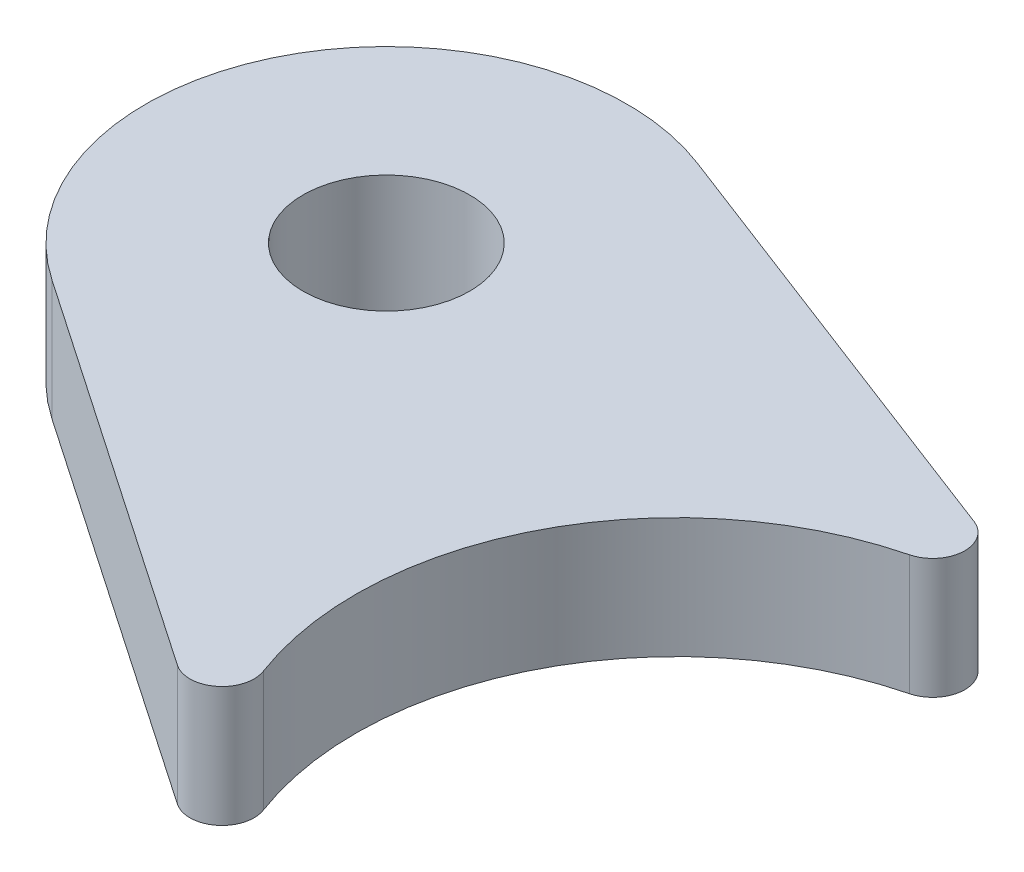
ISO-10303-21;
HEADER;
FILE_DESCRIPTION(('STEP AP214'),'2;1');
FILE_NAME('part.step','',(''),(''),'','','');
FILE_SCHEMA(('AUTOMOTIVE_DESIGN { 1 0 10303 214 1 1 1 1 }'));
ENDSEC;
DATA;
#1=APPLICATION_CONTEXT('core data for automotive mechanical design processes');
#2=APPLICATION_PROTOCOL_DEFINITION('international standard','automotive_design',2000,#1);
#3=PRODUCT_CONTEXT('',#1,'mechanical');
#4=PRODUCT('Part','Part','',(#3));
#5=PRODUCT_RELATED_PRODUCT_CATEGORY('part','',(#4));
#6=PRODUCT_DEFINITION_FORMATION('','',#4);
#7=PRODUCT_DEFINITION_CONTEXT('part definition',#1,'design');
#8=PRODUCT_DEFINITION('design','',#6,#7);
#9=PRODUCT_DEFINITION_SHAPE('','',#8);
#10=(LENGTH_UNIT() NAMED_UNIT(*) SI_UNIT(.MILLI.,.METRE.));
#11=(NAMED_UNIT(*) PLANE_ANGLE_UNIT() SI_UNIT($,.RADIAN.));
#12=(NAMED_UNIT(*) SI_UNIT($,.STERADIAN.) SOLID_ANGLE_UNIT());
#13=UNCERTAINTY_MEASURE_WITH_UNIT(LENGTH_MEASURE(1.E-05),#10,'distance_accuracy_value','');
#14=(GEOMETRIC_REPRESENTATION_CONTEXT(3) GLOBAL_UNCERTAINTY_ASSIGNED_CONTEXT((#13)) GLOBAL_UNIT_ASSIGNED_CONTEXT((#10,
#11,#12)) REPRESENTATION_CONTEXT('',''));
#15=CARTESIAN_POINT('',(0.,0.,0.));
#16=DIRECTION('',(0.,0.,1.));
#17=DIRECTION('',(1.,0.,0.));
#18=AXIS2_PLACEMENT_3D('',#15,#16,#17);
#19=CARTESIAN_POINT('',(0.,0.,0.));
#20=DIRECTION('',(0.,-1.,0.));
#21=DIRECTION('',(0.,0.,-1.));
#22=AXIS2_PLACEMENT_3D('',#19,#20,#21);
#23=PLANE('',#22);
#24=CARTESIAN_POINT('',(0.,0.,0.));
#25=DIRECTION('',(0.,-1.,0.));
#26=DIRECTION('',(0.,0.,-1.));
#27=AXIS2_PLACEMENT_3D('',#24,#25,#26);
#28=CIRCLE('',#27,12.7);
#29=CARTESIAN_POINT('',(-11.8919337985518,0.,4.45779211391252));
#30=VERTEX_POINT('',#29);
#31=CARTESIAN_POINT('',(-3.09980984965173,0.,-12.3158913155322));
#32=VERTEX_POINT('',#31);
#33=EDGE_CURVE('E119',#30,#32,#28,.T.);
#34=ORIENTED_EDGE('',*,*,#33,.F.);
#35=CARTESIAN_POINT('',(-13.081127178407,0.,4.90357132530378));
#36=DIRECTION('',(0.,-1.,0.));
#37=DIRECTION('',(0.,0.,-1.));
#38=AXIS2_PLACEMENT_3D('',#35,#36,#37);
#39=CIRCLE('',#38,1.27);
#40=CARTESIAN_POINT('',(-13.7977985543703,0.,5.95203789075773));
#41=VERTEX_POINT('',#40);
#42=EDGE_CURVE('E133',#30,#41,#39,.T.);
#43=ORIENTED_EDGE('',*,*,#42,.T.);
#44=DIRECTION('',(0.825564224766901,0.,0.564308170049864));
#45=VECTOR('',#44,1.);
#46=CARTESIAN_POINT('',(-29.505035319725,0.,-4.7845247771557));
#47=LINE('',#46,#45);
#48=CARTESIAN_POINT('',(-29.505035319725,0.,-4.7845247771557));
#49=VERTEX_POINT('',#48);
#50=EDGE_CURVE('E117',#49,#41,#47,.T.);
#51=ORIENTED_EDGE('',*,*,#50,.F.);
#52=CARTESIAN_POINT('',(-24.13,0.,-12.6480240180604));
#53=DIRECTION('',(0.,-1.,0.));
#54=DIRECTION('',(0.,0.,-1.));
#55=AXIS2_PLACEMENT_3D('',#52,#53,#54);
#56=CIRCLE('',#55,9.52500000000001);
#57=CARTESIAN_POINT('',(-20.7213013206268,0.,-21.5422017941812));
#58=VERTEX_POINT('',#57);
#59=EDGE_CURVE('E124',#49,#58,#56,.T.);
#60=ORIENTED_EDGE('',*,*,#59,.T.);
#61=DIRECTION('',(0.933771944999551,0.,0.357868627755712));
#62=VECTOR('',#61,1.);
#63=CARTESIAN_POINT('',(-20.7213013206268,0.,-21.5422017941812));
#64=LINE('',#63,#62);
#65=CARTESIAN_POINT('',(-2.95529767736715,0.,-14.7333708172349));
#66=VERTEX_POINT('',#65);
#67=EDGE_CURVE('E98',#58,#66,#64,.T.);
#68=ORIENTED_EDGE('',*,*,#67,.T.);
#69=CARTESIAN_POINT('',(-3.40979083461691,0.,-13.5474804470855));
#70=DIRECTION('',(0.,-1.,0.));
#71=DIRECTION('',(0.,0.,-1.));
#72=AXIS2_PLACEMENT_3D('',#69,#70,#71);
#73=CIRCLE('',#72,1.27);
#74=EDGE_CURVE('E131',#66,#32,#73,.T.);
#75=ORIENTED_EDGE('',*,*,#74,.T.);
#76=EDGE_LOOP('',(#34,#43,#51,#60,#68,#75));
#77=FACE_BOUND('',#76,.T.);
#78=CARTESIAN_POINT('',(-24.13,0.,-12.6480240180604));
#79=DIRECTION('',(0.,1.,0.));
#80=DIRECTION('',(0.,0.,1.));
#81=AXIS2_PLACEMENT_3D('',#78,#79,#80);
#82=CIRCLE('',#81,3.3);
#83=CARTESIAN_POINT('',(-24.13,0.,-9.34802401806044));
#84=VERTEX_POINT('',#83);
#85=EDGE_CURVE('E120',#84,#84,#82,.T.);
#86=ORIENTED_EDGE('',*,*,#85,.T.);
#87=EDGE_LOOP('',(#86));
#88=FACE_BOUND('',#87,.T.);
#89=ADVANCED_FACE('F37',(#77,#88),#23,.T.);
#90=CARTESIAN_POINT('',(0.,4.7625,0.));
#91=DIRECTION('',(0.,-1.,0.));
#92=DIRECTION('',(0.,0.,-1.));
#93=AXIS2_PLACEMENT_3D('',#90,#91,#92);
#94=PLANE('',#93);
#95=DIRECTION('',(0.825564224766901,0.,0.564308170049864));
#96=VECTOR('',#95,1.);
#97=CARTESIAN_POINT('',(-29.505035319725,4.7625,-4.7845247771557));
#98=LINE('',#97,#96);
#99=CARTESIAN_POINT('',(-29.505035319725,4.7625,-4.7845247771557));
#100=VERTEX_POINT('',#99);
#101=CARTESIAN_POINT('',(-13.7977985543703,4.7625,5.95203789075773));
#102=VERTEX_POINT('',#101);
#103=EDGE_CURVE('E125',#100,#102,#98,.T.);
#104=ORIENTED_EDGE('',*,*,#103,.T.);
#105=CARTESIAN_POINT('',(-13.081127178407,4.7625,4.90357132530378));
#106=DIRECTION('',(0.,-1.,0.));
#107=DIRECTION('',(0.,0.,-1.));
#108=AXIS2_PLACEMENT_3D('',#105,#106,#107);
#109=CIRCLE('',#108,1.27);
#110=CARTESIAN_POINT('',(-11.8919337985518,4.7625,4.45779211391252));
#111=VERTEX_POINT('',#110);
#112=EDGE_CURVE('E45',#102,#111,#109,.F.);
#113=ORIENTED_EDGE('',*,*,#112,.T.);
#114=CARTESIAN_POINT('',(0.,4.7625,0.));
#115=DIRECTION('',(0.,-1.,0.));
#116=DIRECTION('',(0.,0.,-1.));
#117=AXIS2_PLACEMENT_3D('',#114,#115,#116);
#118=CIRCLE('',#117,12.7);
#119=CARTESIAN_POINT('',(-3.09980984965173,4.7625,-12.3158913155322));
#120=VERTEX_POINT('',#119);
#121=EDGE_CURVE('E110',#111,#120,#118,.T.);
#122=ORIENTED_EDGE('',*,*,#121,.T.);
#123=CARTESIAN_POINT('',(-3.40979083461691,4.7625,-13.5474804470855));
#124=DIRECTION('',(0.,-1.,0.));
#125=DIRECTION('',(0.,0.,-1.));
#126=AXIS2_PLACEMENT_3D('',#123,#124,#125);
#127=CIRCLE('',#126,1.27);
#128=CARTESIAN_POINT('',(-2.95529767736715,4.7625,-14.7333708172349));
#129=VERTEX_POINT('',#128);
#130=EDGE_CURVE('E52',#120,#129,#127,.F.);
#131=ORIENTED_EDGE('',*,*,#130,.T.);
#132=DIRECTION('',(0.933771944999551,0.,0.357868627755712));
#133=VECTOR('',#132,1.);
#134=CARTESIAN_POINT('',(-20.7213013206268,4.7625,-21.5422017941812));
#135=LINE('',#134,#133);
#136=CARTESIAN_POINT('',(-20.7213013206268,4.7625,-21.5422017941812));
#137=VERTEX_POINT('',#136);
#138=EDGE_CURVE('E95',#137,#129,#135,.T.);
#139=ORIENTED_EDGE('',*,*,#138,.F.);
#140=CARTESIAN_POINT('',(-24.13,4.7625,-12.6480240180604));
#141=DIRECTION('',(0.,-1.,0.));
#142=DIRECTION('',(0.,0.,-1.));
#143=AXIS2_PLACEMENT_3D('',#140,#141,#142);
#144=CIRCLE('',#143,9.52500000000001);
#145=EDGE_CURVE('E109',#100,#137,#144,.T.);
#146=ORIENTED_EDGE('',*,*,#145,.F.);
#147=EDGE_LOOP('',(#104,#113,#122,#131,#139,#146));
#148=FACE_BOUND('',#147,.T.);
#149=CARTESIAN_POINT('',(-24.13,4.7625,-12.6480240180604));
#150=DIRECTION('',(0.,1.,0.));
#151=DIRECTION('',(0.,0.,1.));
#152=AXIS2_PLACEMENT_3D('',#149,#150,#151);
#153=CIRCLE('',#152,3.29999999999999);
#154=CARTESIAN_POINT('',(-24.13,4.7625,-9.34802401806045));
#155=VERTEX_POINT('',#154);
#156=EDGE_CURVE('E153',#155,#155,#153,.T.);
#157=ORIENTED_EDGE('',*,*,#156,.F.);
#158=EDGE_LOOP('',(#157));
#159=FACE_BOUND('',#158,.T.);
#160=ADVANCED_FACE('F107',(#148,#159),#94,.F.);
#161=CARTESIAN_POINT('',(-29.505035319725,4.7625,-4.7845247771557));
#162=DIRECTION('',(0.564308170049864,0.,-0.825564224766901));
#163=DIRECTION('',(-0.825564224766901,0.,-0.564308170049864));
#164=AXIS2_PLACEMENT_3D('',#161,#162,#163);
#165=PLANE('',#164);
#166=ORIENTED_EDGE('',*,*,#50,.T.);
#167=DIRECTION('',(0.,-1.,0.));
#168=VECTOR('',#167,1.);
#169=CARTESIAN_POINT('',(-13.7977985543703,4.7625,5.95203789075774));
#170=LINE('',#169,#168);
#171=EDGE_CURVE('E60',#41,#102,#170,.F.);
#172=ORIENTED_EDGE('',*,*,#171,.T.);
#173=ORIENTED_EDGE('',*,*,#103,.F.);
#174=DIRECTION('',(0.,-1.,0.));
#175=VECTOR('',#174,1.);
#176=CARTESIAN_POINT('',(-29.505035319725,4.7625,-4.7845247771557));
#177=LINE('',#176,#175);
#178=EDGE_CURVE('E104',#100,#49,#177,.T.);
#179=ORIENTED_EDGE('',*,*,#178,.T.);
#180=EDGE_LOOP('',(#166,#172,#173,#179));
#181=FACE_BOUND('',#180,.T.);
#182=ADVANCED_FACE('F148',(#181),#165,.F.);
#183=CARTESIAN_POINT('',(0.,4.7625,0.));
#184=DIRECTION('',(0.,-1.,0.));
#185=DIRECTION('',(0.,0.,-1.));
#186=AXIS2_PLACEMENT_3D('',#183,#184,#185);
#187=CYLINDRICAL_SURFACE('',#186,12.7);
#188=ORIENTED_EDGE('',*,*,#121,.F.);
#189=DIRECTION('',(0.,-1.,0.));
#190=VECTOR('',#189,1.);
#191=CARTESIAN_POINT('',(-11.8919337985518,4.7625,4.45779211391252));
#192=LINE('',#191,#190);
#193=EDGE_CURVE('E128',#111,#30,#192,.T.);
#194=ORIENTED_EDGE('',*,*,#193,.T.);
#195=ORIENTED_EDGE('',*,*,#33,.T.);
#196=DIRECTION('',(0.,-1.,0.));
#197=VECTOR('',#196,1.);
#198=CARTESIAN_POINT('',(-3.09980984965173,4.7625,-12.3158913155322));
#199=LINE('',#198,#197);
#200=EDGE_CURVE('E103',#32,#120,#199,.F.);
#201=ORIENTED_EDGE('',*,*,#200,.T.);
#202=EDGE_LOOP('',(#188,#194,#195,#201));
#203=FACE_BOUND('',#202,.T.);
#204=ADVANCED_FACE('F141',(#203),#187,.F.);
#205=CARTESIAN_POINT('',(-20.7213013206268,4.7625,-21.5422017941812));
#206=DIRECTION('',(0.357868627755712,0.,-0.933771944999551));
#207=DIRECTION('',(-0.933771944999551,0.,-0.357868627755712));
#208=AXIS2_PLACEMENT_3D('',#205,#206,#207);
#209=PLANE('',#208);
#210=ORIENTED_EDGE('',*,*,#138,.T.);
#211=DIRECTION('',(0.,1.,0.));
#212=VECTOR('',#211,1.);
#213=CARTESIAN_POINT('',(-2.95529767736715,0.,-14.7333708172349));
#214=LINE('',#213,#212);
#215=EDGE_CURVE('E11',#129,#66,#214,.F.);
#216=ORIENTED_EDGE('',*,*,#215,.T.);
#217=ORIENTED_EDGE('',*,*,#67,.F.);
#218=DIRECTION('',(0.,-1.,0.));
#219=VECTOR('',#218,1.);
#220=CARTESIAN_POINT('',(-20.7213013206268,4.7625,-21.5422017941812));
#221=LINE('',#220,#219);
#222=EDGE_CURVE('E93',#137,#58,#221,.T.);
#223=ORIENTED_EDGE('',*,*,#222,.F.);
#224=EDGE_LOOP('',(#210,#216,#217,#223));
#225=FACE_BOUND('',#224,.T.);
#226=ADVANCED_FACE('F94',(#225),#209,.T.);
#227=CARTESIAN_POINT('',(-24.13,4.7625,-12.6480240180604));
#228=DIRECTION('',(0.,-1.,0.));
#229=DIRECTION('',(0.,0.,-1.));
#230=AXIS2_PLACEMENT_3D('',#227,#228,#229);
#231=CYLINDRICAL_SURFACE('',#230,9.52500000000001);
#232=ORIENTED_EDGE('',*,*,#59,.F.);
#233=ORIENTED_EDGE('',*,*,#178,.F.);
#234=ORIENTED_EDGE('',*,*,#145,.T.);
#235=ORIENTED_EDGE('',*,*,#222,.T.);
#236=EDGE_LOOP('',(#232,#233,#234,#235));
#237=FACE_BOUND('',#236,.T.);
#238=ADVANCED_FACE('F112',(#237),#231,.T.);
#239=CARTESIAN_POINT('',(-13.081127178407,4.7625,4.90357132530378));
#240=DIRECTION('',(0.,-1.,0.));
#241=DIRECTION('',(0.,0.,-1.));
#242=AXIS2_PLACEMENT_3D('',#239,#240,#241);
#243=CYLINDRICAL_SURFACE('',#242,1.27);
#244=ORIENTED_EDGE('',*,*,#112,.F.);
#245=ORIENTED_EDGE('',*,*,#171,.F.);
#246=ORIENTED_EDGE('',*,*,#42,.F.);
#247=ORIENTED_EDGE('',*,*,#193,.F.);
#248=EDGE_LOOP('',(#244,#245,#246,#247));
#249=FACE_BOUND('',#248,.T.);
#250=ADVANCED_FACE('F144',(#249),#243,.T.);
#251=CARTESIAN_POINT('',(-3.40979083461691,4.7625,-13.5474804470855));
#252=DIRECTION('',(0.,-1.,0.));
#253=DIRECTION('',(0.,0.,-1.));
#254=AXIS2_PLACEMENT_3D('',#251,#252,#253);
#255=CYLINDRICAL_SURFACE('',#254,1.27);
#256=ORIENTED_EDGE('',*,*,#130,.F.);
#257=ORIENTED_EDGE('',*,*,#200,.F.);
#258=ORIENTED_EDGE('',*,*,#74,.F.);
#259=ORIENTED_EDGE('',*,*,#215,.F.);
#260=EDGE_LOOP('',(#256,#257,#258,#259));
#261=FACE_BOUND('',#260,.T.);
#262=ADVANCED_FACE('F39',(#261),#255,.T.);
#263=CARTESIAN_POINT('',(-24.13,4.7625,-12.6480240180604));
#264=DIRECTION('',(0.,1.,0.));
#265=DIRECTION('',(0.,0.,1.));
#266=AXIS2_PLACEMENT_3D('',#263,#264,#265);
#267=CYLINDRICAL_SURFACE('',#266,3.29999999999999);
#268=ORIENTED_EDGE('',*,*,#85,.F.);
#269=EDGE_LOOP('',(#268));
#270=FACE_BOUND('',#269,.T.);
#271=ORIENTED_EDGE('',*,*,#156,.T.);
#272=EDGE_LOOP('',(#271));
#273=FACE_BOUND('',#272,.T.);
#274=ADVANCED_FACE('F157',(#270,#273),#267,.F.);
#275=CLOSED_SHELL('',(#89,#160,#182,#204,#226,#238,#250,#262,#274));
#276=MANIFOLD_SOLID_BREP('B2',#275);
#277=ADVANCED_BREP_SHAPE_REPRESENTATION('',(#18,#276),#14);
#278=SHAPE_DEFINITION_REPRESENTATION(#9,#277);
ENDSEC;
END-ISO-10303-21;
